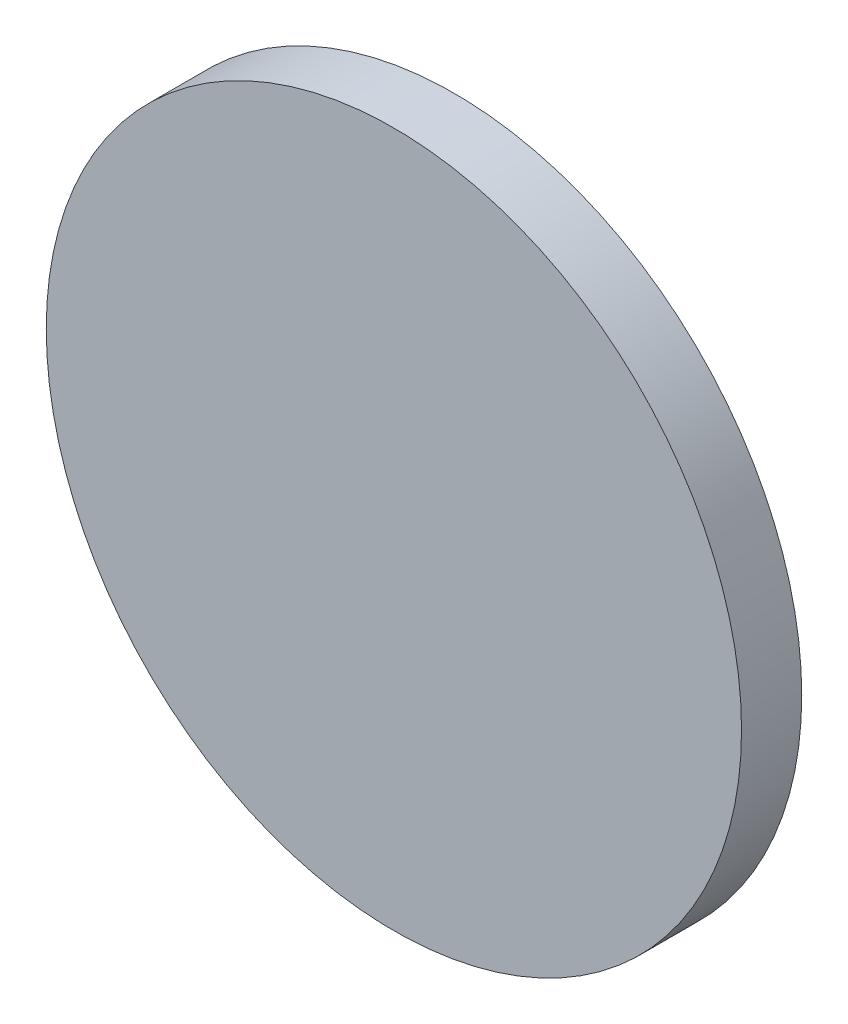
ISO-10303-21;
HEADER;
FILE_DESCRIPTION(('STEP AP214'),'2;1');
FILE_NAME('part.step','',(''),(''),'','','');
FILE_SCHEMA(('AUTOMOTIVE_DESIGN { 1 0 10303 214 1 1 1 1 }'));
ENDSEC;
DATA;
#1=APPLICATION_CONTEXT('core data for automotive mechanical design processes');
#2=APPLICATION_PROTOCOL_DEFINITION('international standard','automotive_design',2000,#1);
#3=PRODUCT_CONTEXT('',#1,'mechanical');
#4=PRODUCT('Part','Part','',(#3));
#5=PRODUCT_RELATED_PRODUCT_CATEGORY('part','',(#4));
#6=PRODUCT_DEFINITION_FORMATION('','',#4);
#7=PRODUCT_DEFINITION_CONTEXT('part definition',#1,'design');
#8=PRODUCT_DEFINITION('design','',#6,#7);
#9=PRODUCT_DEFINITION_SHAPE('','',#8);
#10=(LENGTH_UNIT() NAMED_UNIT(*) SI_UNIT(.MILLI.,.METRE.));
#11=(NAMED_UNIT(*) PLANE_ANGLE_UNIT() SI_UNIT($,.RADIAN.));
#12=(NAMED_UNIT(*) SI_UNIT($,.STERADIAN.) SOLID_ANGLE_UNIT());
#13=UNCERTAINTY_MEASURE_WITH_UNIT(LENGTH_MEASURE(1.E-05),#10,'distance_accuracy_value','');
#14=(GEOMETRIC_REPRESENTATION_CONTEXT(3) GLOBAL_UNCERTAINTY_ASSIGNED_CONTEXT((#13)) GLOBAL_UNIT_ASSIGNED_CONTEXT((#10,
#11,#12)) REPRESENTATION_CONTEXT('',''));
#15=CARTESIAN_POINT('',(0.,0.,0.));
#16=DIRECTION('',(0.,0.,1.));
#17=DIRECTION('',(1.,0.,0.));
#18=AXIS2_PLACEMENT_3D('',#15,#16,#17);
#19=CARTESIAN_POINT('',(0.,0.,1.1));
#20=DIRECTION('',(0.,0.,-1.));
#21=DIRECTION('',(-1.,0.,0.));
#22=AXIS2_PLACEMENT_3D('',#19,#20,#21);
#23=CYLINDRICAL_SURFACE('',#22,6.35);
#24=CARTESIAN_POINT('',(0.,0.,1.1));
#25=DIRECTION('',(0.,0.,1.));
#26=DIRECTION('',(1.,0.,0.));
#27=AXIS2_PLACEMENT_3D('',#24,#25,#26);
#28=CIRCLE('',#27,6.35);
#29=CARTESIAN_POINT('',(6.35,0.,1.1));
#30=VERTEX_POINT('',#29);
#31=EDGE_CURVE('E10',#30,#30,#28,.T.);
#32=ORIENTED_EDGE('',*,*,#31,.F.);
#33=EDGE_LOOP('',(#32));
#34=FACE_BOUND('',#33,.T.);
#35=CARTESIAN_POINT('',(0.,0.,0.));
#36=DIRECTION('',(0.,0.,1.));
#37=DIRECTION('',(1.,0.,0.));
#38=AXIS2_PLACEMENT_3D('',#35,#36,#37);
#39=CIRCLE('',#38,6.35);
#40=CARTESIAN_POINT('',(6.35,0.,0.));
#41=VERTEX_POINT('',#40);
#42=EDGE_CURVE('E33',#41,#41,#39,.T.);
#43=ORIENTED_EDGE('',*,*,#42,.T.);
#44=EDGE_LOOP('',(#43));
#45=FACE_BOUND('',#44,.T.);
#46=ADVANCED_FACE('F30',(#34,#45),#23,.T.);
#47=CARTESIAN_POINT('',(0.,0.,1.1));
#48=DIRECTION('',(0.,0.,1.));
#49=DIRECTION('',(1.,0.,0.));
#50=AXIS2_PLACEMENT_3D('',#47,#48,#49);
#51=PLANE('',#50);
#52=ORIENTED_EDGE('',*,*,#31,.T.);
#53=EDGE_LOOP('',(#52));
#54=FACE_BOUND('',#53,.T.);
#55=ADVANCED_FACE('F45',(#54),#51,.T.);
#56=CARTESIAN_POINT('',(0.,0.,0.));
#57=DIRECTION('',(0.,0.,1.));
#58=DIRECTION('',(1.,0.,0.));
#59=AXIS2_PLACEMENT_3D('',#56,#57,#58);
#60=PLANE('',#59);
#61=ORIENTED_EDGE('',*,*,#42,.F.);
#62=EDGE_LOOP('',(#61));
#63=FACE_BOUND('',#62,.T.);
#64=ADVANCED_FACE('F43',(#63),#60,.F.);
#65=CLOSED_SHELL('',(#46,#55,#64));
#66=MANIFOLD_SOLID_BREP('B2',#65);
#67=ADVANCED_BREP_SHAPE_REPRESENTATION('',(#18,#66),#14);
#68=SHAPE_DEFINITION_REPRESENTATION(#9,#67);
ENDSEC;
END-ISO-10303-21;
